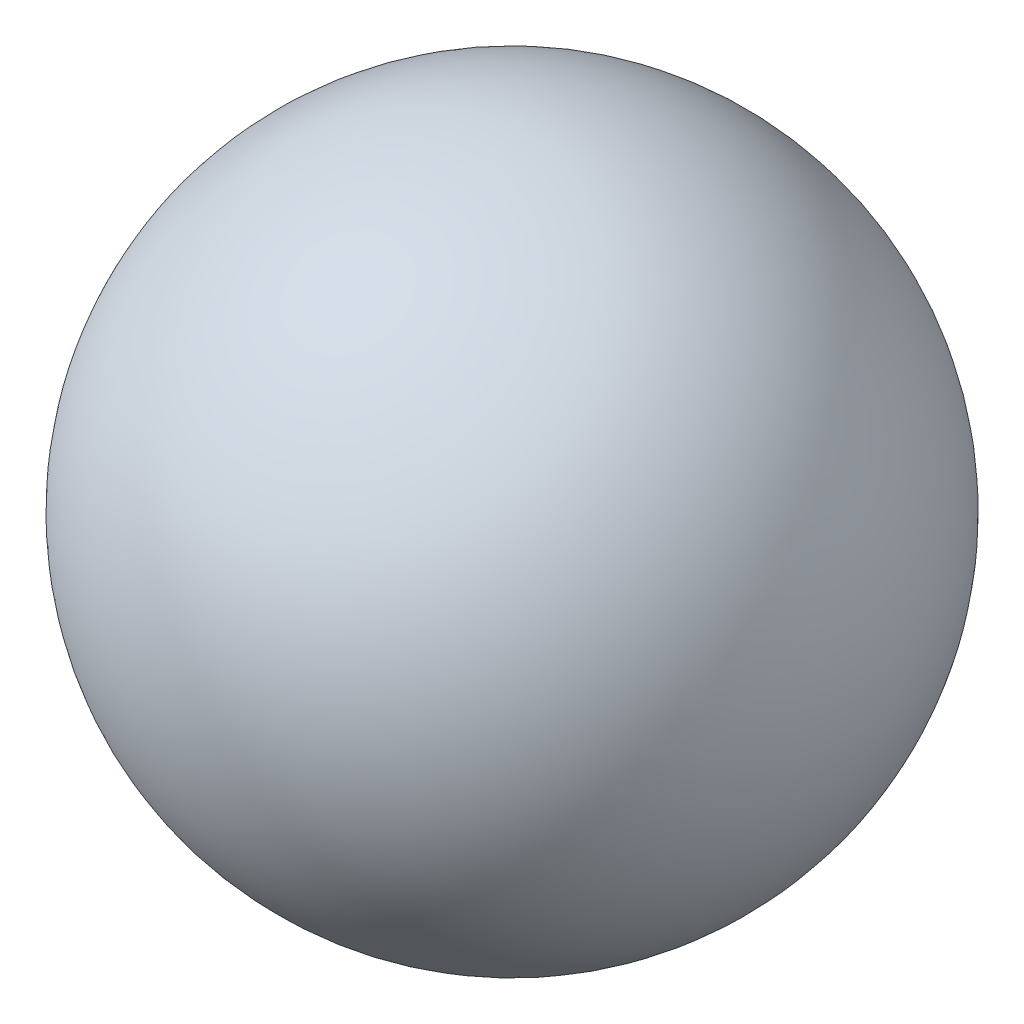
ISO-10303-21;
HEADER;
FILE_DESCRIPTION(('STEP AP214'),'2;1');
FILE_NAME('part.step','',(''),(''),'','','');
FILE_SCHEMA(('AUTOMOTIVE_DESIGN { 1 0 10303 214 1 1 1 1 }'));
ENDSEC;
DATA;
#1=APPLICATION_CONTEXT('core data for automotive mechanical design processes');
#2=APPLICATION_PROTOCOL_DEFINITION('international standard','automotive_design',2000,#1);
#3=PRODUCT_CONTEXT('',#1,'mechanical');
#4=PRODUCT('Part','Part','',(#3));
#5=PRODUCT_RELATED_PRODUCT_CATEGORY('part','',(#4));
#6=PRODUCT_DEFINITION_FORMATION('','',#4);
#7=PRODUCT_DEFINITION_CONTEXT('part definition',#1,'design');
#8=PRODUCT_DEFINITION('design','',#6,#7);
#9=PRODUCT_DEFINITION_SHAPE('','',#8);
#10=(LENGTH_UNIT() NAMED_UNIT(*) SI_UNIT(.MILLI.,.METRE.));
#11=(NAMED_UNIT(*) PLANE_ANGLE_UNIT() SI_UNIT($,.RADIAN.));
#12=(NAMED_UNIT(*) SI_UNIT($,.STERADIAN.) SOLID_ANGLE_UNIT());
#13=UNCERTAINTY_MEASURE_WITH_UNIT(LENGTH_MEASURE(1.E-05),#10,'distance_accuracy_value','');
#14=(GEOMETRIC_REPRESENTATION_CONTEXT(3) GLOBAL_UNCERTAINTY_ASSIGNED_CONTEXT((#13)) GLOBAL_UNIT_ASSIGNED_CONTEXT((#10,
#11,#12)) REPRESENTATION_CONTEXT('',''));
#15=CARTESIAN_POINT('',(0.,0.,0.));
#16=DIRECTION('',(0.,0.,1.));
#17=DIRECTION('',(1.,0.,0.));
#18=AXIS2_PLACEMENT_3D('',#15,#16,#17);
#19=CARTESIAN_POINT('',(0.,10.,0.));
#20=DIRECTION('',(1.,0.,0.));
#21=DIRECTION('',(0.,1.,0.));
#22=AXIS2_PLACEMENT_3D('',#19,#20,#21);
#23=SPHERICAL_SURFACE('',#22,2.28571428571429);
#24=CARTESIAN_POINT('',(2.28571428571429,10.,0.));
#25=VERTEX_POINT('',#24);
#26=VERTEX_LOOP('',#25);
#27=FACE_BOUND('',#26,.T.);
#28=ADVANCED_FACE('F346',(#27),#23,.T.);
#29=CLOSED_SHELL('',(#28));
#30=MANIFOLD_SOLID_BREP('B2',#29);
#31=ADVANCED_BREP_SHAPE_REPRESENTATION('',(#18,#30),#14);
#32=SHAPE_DEFINITION_REPRESENTATION(#9,#31);
ENDSEC;
END-ISO-10303-21;
